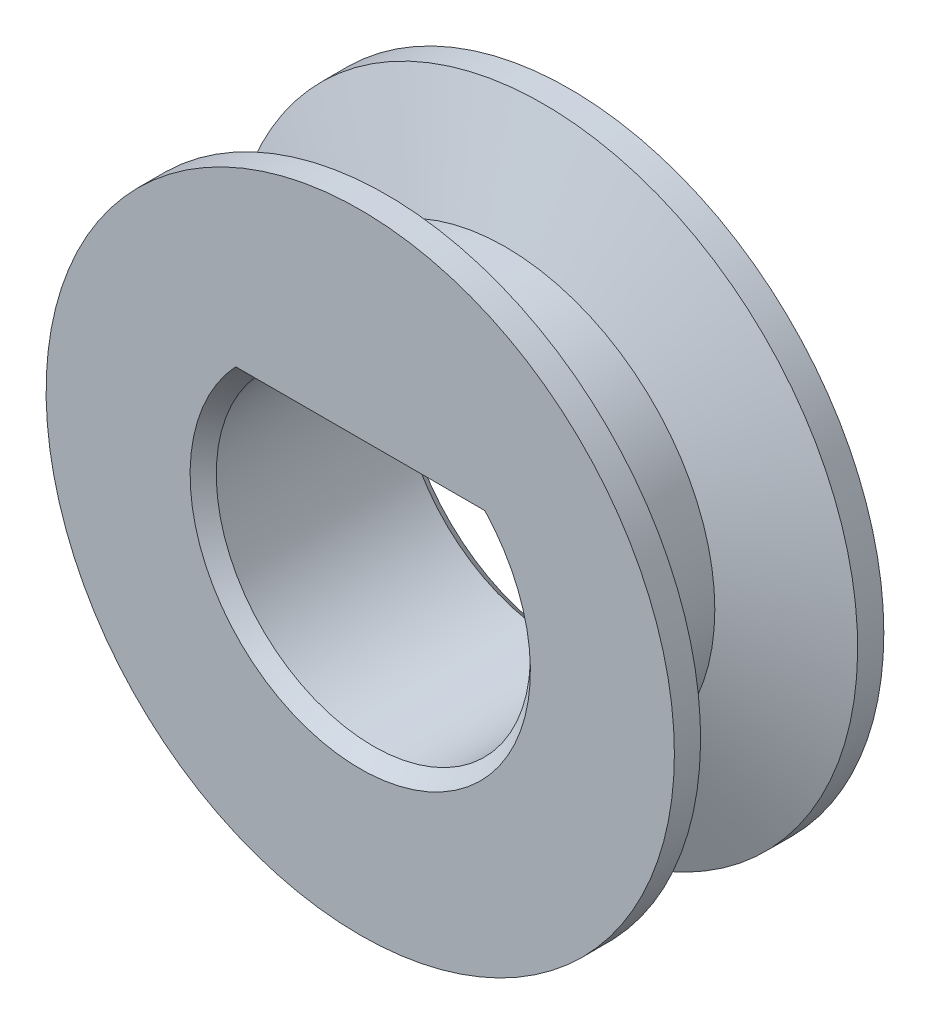
ISO-10303-21;
HEADER;
FILE_DESCRIPTION(('STEP AP214'),'2;1');
FILE_NAME('part.step','',(''),(''),'','','');
FILE_SCHEMA(('AUTOMOTIVE_DESIGN { 1 0 10303 214 1 1 1 1 }'));
ENDSEC;
DATA;
#1=APPLICATION_CONTEXT('core data for automotive mechanical design processes');
#2=APPLICATION_PROTOCOL_DEFINITION('international standard','automotive_design',2000,#1);
#3=PRODUCT_CONTEXT('',#1,'mechanical');
#4=PRODUCT('Part','Part','',(#3));
#5=PRODUCT_RELATED_PRODUCT_CATEGORY('part','',(#4));
#6=PRODUCT_DEFINITION_FORMATION('','',#4);
#7=PRODUCT_DEFINITION_CONTEXT('part definition',#1,'design');
#8=PRODUCT_DEFINITION('design','',#6,#7);
#9=PRODUCT_DEFINITION_SHAPE('','',#8);
#10=(LENGTH_UNIT() NAMED_UNIT(*) SI_UNIT(.MILLI.,.METRE.));
#11=(NAMED_UNIT(*) PLANE_ANGLE_UNIT() SI_UNIT($,.RADIAN.));
#12=(NAMED_UNIT(*) SI_UNIT($,.STERADIAN.) SOLID_ANGLE_UNIT());
#13=UNCERTAINTY_MEASURE_WITH_UNIT(LENGTH_MEASURE(1.E-05),#10,'distance_accuracy_value','');
#14=(GEOMETRIC_REPRESENTATION_CONTEXT(3) GLOBAL_UNCERTAINTY_ASSIGNED_CONTEXT((#13)) GLOBAL_UNIT_ASSIGNED_CONTEXT((#10,
#11,#12)) REPRESENTATION_CONTEXT('',''));
#15=CARTESIAN_POINT('',(0.,0.,0.));
#16=DIRECTION('',(0.,0.,1.));
#17=DIRECTION('',(1.,0.,0.));
#18=AXIS2_PLACEMENT_3D('',#15,#16,#17);
#19=CARTESIAN_POINT('',(0.,0.,6.35));
#20=DIRECTION('',(0.,0.,-1.));
#21=DIRECTION('',(-1.,0.,0.));
#22=AXIS2_PLACEMENT_3D('',#19,#20,#21);
#23=CYLINDRICAL_SURFACE('',#22,19.05);
#24=CARTESIAN_POINT('',(0.,0.,6.35));
#25=DIRECTION('',(0.,0.,1.));
#26=DIRECTION('',(1.,0.,0.));
#27=AXIS2_PLACEMENT_3D('',#24,#25,#26);
#28=CIRCLE('',#27,19.05);
#29=CARTESIAN_POINT('',(19.05,0.,6.35));
#30=VERTEX_POINT('',#29);
#31=EDGE_CURVE('E111',#30,#30,#28,.T.);
#32=ORIENTED_EDGE('',*,*,#31,.F.);
#33=EDGE_LOOP('',(#32));
#34=FACE_BOUND('',#33,.T.);
#35=CARTESIAN_POINT('',(0.,0.,4.76250000000002));
#36=DIRECTION('',(0.,0.,1.));
#37=DIRECTION('',(0.,-1.,0.));
#38=AXIS2_PLACEMENT_3D('',#35,#36,#37);
#39=CIRCLE('',#38,19.05);
#40=CARTESIAN_POINT('',(0.,-19.05,4.76250000000004));
#41=VERTEX_POINT('',#40);
#42=EDGE_CURVE('E116',#41,#41,#39,.T.);
#43=ORIENTED_EDGE('',*,*,#42,.T.);
#44=EDGE_LOOP('',(#43));
#45=FACE_BOUND('',#44,.T.);
#46=ADVANCED_FACE('F39',(#34,#45),#23,.T.);
#47=CARTESIAN_POINT('',(0.,0.,-6.35));
#48=DIRECTION('',(0.,0.,1.));
#49=DIRECTION('',(1.,0.,0.));
#50=AXIS2_PLACEMENT_3D('',#47,#48,#49);
#51=CIRCLE('',#50,19.05);
#52=CARTESIAN_POINT('',(19.05,0.,-6.35));
#53=VERTEX_POINT('',#52);
#54=EDGE_CURVE('E112',#53,#53,#51,.T.);
#55=ORIENTED_EDGE('',*,*,#54,.T.);
#56=EDGE_LOOP('',(#55));
#57=FACE_BOUND('',#56,.T.);
#58=CARTESIAN_POINT('',(0.,0.,-4.76249999999998));
#59=DIRECTION('',(0.,0.,1.));
#60=DIRECTION('',(0.,-1.,0.));
#61=AXIS2_PLACEMENT_3D('',#58,#59,#60);
#62=CIRCLE('',#61,19.05);
#63=CARTESIAN_POINT('',(0.,-19.05,-4.76249999999996));
#64=VERTEX_POINT('',#63);
#65=EDGE_CURVE('E123',#64,#64,#62,.T.);
#66=ORIENTED_EDGE('',*,*,#65,.F.);
#67=EDGE_LOOP('',(#66));
#68=FACE_BOUND('',#67,.T.);
#69=ADVANCED_FACE('F172',(#57,#68),#23,.T.);
#70=CARTESIAN_POINT('',(0.,0.,6.35));
#71=DIRECTION('',(0.,0.,1.));
#72=DIRECTION('',(1.,0.,0.));
#73=AXIS2_PLACEMENT_3D('',#70,#71,#72);
#74=PLANE('',#73);
#75=CARTESIAN_POINT('',(0.,0.,6.35));
#76=DIRECTION('',(0.,0.,1.));
#77=DIRECTION('',(1.,0.,0.));
#78=AXIS2_PLACEMENT_3D('',#75,#76,#77);
#79=CIRCLE('',#78,10.31875);
#80=CARTESIAN_POINT('',(7.55817283227236,7.02499999999999,6.35));
#81=VERTEX_POINT('',#80);
#82=CARTESIAN_POINT('',(-7.55817283227237,7.025,6.35));
#83=VERTEX_POINT('',#82);
#84=EDGE_CURVE('E93',#81,#83,#79,.F.);
#85=ORIENTED_EDGE('',*,*,#84,.T.);
#86=DIRECTION('',(-1.,0.,0.));
#87=VECTOR('',#86,1.);
#88=CARTESIAN_POINT('',(0.,7.025,6.35));
#89=LINE('',#88,#87);
#90=EDGE_CURVE('E60',#81,#83,#89,.T.);
#91=ORIENTED_EDGE('',*,*,#90,.F.);
#92=EDGE_LOOP('',(#85,#91));
#93=FACE_BOUND('',#92,.T.);
#94=ORIENTED_EDGE('',*,*,#31,.T.);
#95=EDGE_LOOP('',(#94));
#96=FACE_BOUND('',#95,.T.);
#97=ADVANCED_FACE('F96',(#93,#96),#74,.T.);
#98=CARTESIAN_POINT('',(0.,0.,-6.35));
#99=DIRECTION('',(0.,0.,1.));
#100=DIRECTION('',(1.,0.,0.));
#101=AXIS2_PLACEMENT_3D('',#98,#99,#100);
#102=PLANE('',#101);
#103=CARTESIAN_POINT('',(0.,0.,-6.35));
#104=DIRECTION('',(0.,0.,1.));
#105=DIRECTION('',(1.,0.,0.));
#106=AXIS2_PLACEMENT_3D('',#103,#104,#105);
#107=CIRCLE('',#106,10.31875);
#108=CARTESIAN_POINT('',(-7.55817283227237,7.025,-6.35));
#109=VERTEX_POINT('',#108);
#110=CARTESIAN_POINT('',(7.55817283227237,7.025,-6.35));
#111=VERTEX_POINT('',#110);
#112=EDGE_CURVE('E107',#109,#111,#107,.T.);
#113=ORIENTED_EDGE('',*,*,#112,.T.);
#114=DIRECTION('',(-1.,0.,0.));
#115=VECTOR('',#114,1.);
#116=CARTESIAN_POINT('',(0.,7.025,-6.35));
#117=LINE('',#116,#115);
#118=EDGE_CURVE('E89',#111,#109,#117,.T.);
#119=ORIENTED_EDGE('',*,*,#118,.T.);
#120=EDGE_LOOP('',(#113,#119));
#121=FACE_BOUND('',#120,.T.);
#122=ORIENTED_EDGE('',*,*,#54,.F.);
#123=EDGE_LOOP('',(#122));
#124=FACE_BOUND('',#123,.T.);
#125=ADVANCED_FACE('F168',(#121,#124),#102,.F.);
#126=CARTESIAN_POINT('',(0.,0.,6.35));
#127=DIRECTION('',(0.,0.,-1.));
#128=DIRECTION('',(-1.,0.,0.));
#129=AXIS2_PLACEMENT_3D('',#126,#127,#128);
#130=CYLINDRICAL_SURFACE('',#129,9.525);
#131=DIRECTION('',(0.,0.,-1.));
#132=VECTOR('',#131,1.);
#133=CARTESIAN_POINT('',(-6.4323401651343,7.025,6.35));
#134=LINE('',#133,#132);
#135=CARTESIAN_POINT('',(-6.4323401651343,7.025,5.55625000000001));
#136=VERTEX_POINT('',#135);
#137=CARTESIAN_POINT('',(-6.4323401651343,7.025,-5.55624999999999));
#138=VERTEX_POINT('',#137);
#139=EDGE_CURVE('E67',#136,#138,#134,.T.);
#140=ORIENTED_EDGE('',*,*,#139,.F.);
#141=CARTESIAN_POINT('',(0.,0.,5.55625000000001));
#142=DIRECTION('',(0.,0.,1.));
#143=DIRECTION('',(1.,0.,0.));
#144=AXIS2_PLACEMENT_3D('',#141,#142,#143);
#145=CIRCLE('',#144,9.525);
#146=CARTESIAN_POINT('',(6.4323401651343,7.025,5.55625000000001));
#147=VERTEX_POINT('',#146);
#148=EDGE_CURVE('E95',#136,#147,#145,.T.);
#149=ORIENTED_EDGE('',*,*,#148,.T.);
#150=DIRECTION('',(0.,0.,-1.));
#151=VECTOR('',#150,1.);
#152=CARTESIAN_POINT('',(6.4323401651343,7.025,6.35));
#153=LINE('',#152,#151);
#154=CARTESIAN_POINT('',(6.4323401651343,7.025,-5.55624999999999));
#155=VERTEX_POINT('',#154);
#156=EDGE_CURVE('E88',#155,#147,#153,.F.);
#157=ORIENTED_EDGE('',*,*,#156,.F.);
#158=CARTESIAN_POINT('',(0.,0.,-5.55624999999999));
#159=DIRECTION('',(0.,0.,1.));
#160=DIRECTION('',(1.,0.,0.));
#161=AXIS2_PLACEMENT_3D('',#158,#159,#160);
#162=CIRCLE('',#161,9.525);
#163=EDGE_CURVE('E99',#155,#138,#162,.F.);
#164=ORIENTED_EDGE('',*,*,#163,.T.);
#165=EDGE_LOOP('',(#140,#149,#157,#164));
#166=FACE_BOUND('',#165,.T.);
#167=ADVANCED_FACE('F165',(#166),#130,.F.);
#168=CARTESIAN_POINT('',(0.,0.,-6.35));
#169=DIRECTION('',(0.,0.,-1.));
#170=DIRECTION('',(-1.,0.,0.));
#171=AXIS2_PLACEMENT_3D('',#168,#169,#170);
#172=CONICAL_SURFACE('',#171,10.31875,0.785398163397444);
#173=CARTESIAN_POINT('',(7.55887283227237,7.025,-6.3505127398698));
#174=CARTESIAN_POINT('',(7.35918376734583,7.025,-6.20428210737378));
#175=CARTESIAN_POINT('',(7.15823650909128,7.025,-6.05973510950676));
#176=CARTESIAN_POINT('',(6.75330813641482,7.025,-5.77480510392177));
#177=CARTESIAN_POINT('',(6.54932596627355,7.025,-5.63442359857722));
#178=CARTESIAN_POINT('',(6.13572671734288,7.025,-5.35723538660261));
#179=CARTESIAN_POINT('',(5.92607255101002,7.025,-5.22048378604721));
#180=CARTESIAN_POINT('',(5.5027547191316,7.025,-4.95335500391701));
#181=CARTESIAN_POINT('',(5.28909143621302,7.025,-4.82297721826932));
#182=CARTESIAN_POINT('',(4.84720322304358,7.025,-4.56427107586428));
#183=CARTESIAN_POINT('',(4.61876043588918,7.025,-4.43631250634793));
#184=CARTESIAN_POINT('',(4.15604697189045,7.025,-4.19120319052274));
#185=CARTESIAN_POINT('',(3.92177517493466,7.025,-4.07405454215037));
#186=CARTESIAN_POINT('',(3.44783902345874,7.025,-3.85393355395984));
#187=CARTESIAN_POINT('',(3.20820254625919,7.025,-3.75090178751882));
#188=CARTESIAN_POINT('',(2.7222966344759,7.025,-3.56195297840616));
#189=CARTESIAN_POINT('',(2.47603006971896,7.025,-3.47602866181999));
#190=CARTESIAN_POINT('',(1.99237061337791,7.025,-3.32990663640797));
#191=CARTESIAN_POINT('',(1.75536251931875,7.025,-3.26845237530359));
#192=CARTESIAN_POINT('',(1.27660854390951,7.025,-3.1674727036118));
#193=CARTESIAN_POINT('',(1.03486225677415,7.025,-3.12794917977335));
#194=CARTESIAN_POINT('',(0.552693200414345,7.025,-3.07395724161468));
#195=CARTESIAN_POINT('',(0.312317663752019,7.025,-3.05907476799949));
#196=CARTESIAN_POINT('',(-0.16868481179032,7.025,-3.0541593905883));
#197=CARTESIAN_POINT('',(-0.409311740248259,7.025,-3.06412549454263));
#198=CARTESIAN_POINT('',(-0.887554271636123,7.025,-3.10810027201538));
#199=CARTESIAN_POINT('',(-1.12517692268705,7.025,-3.14203391318887));
#200=CARTESIAN_POINT('',(-1.59626144111941,7.025,-3.2316060393892));
#201=CARTESIAN_POINT('',(-1.82972256784798,7.025,-3.28724834849942));
#202=CARTESIAN_POINT('',(-2.2951310330695,7.025,-3.41823297936481));
#203=CARTESIAN_POINT('',(-2.52698980625698,7.025,-3.49388525698239));
#204=CARTESIAN_POINT('',(-2.98482535058206,7.025,-3.66108327264713));
#205=CARTESIAN_POINT('',(-3.21080225130836,7.025,-3.75262866019784));
#206=CARTESIAN_POINT('',(-3.62223490032216,7.025,-3.93331260256056));
#207=CARTESIAN_POINT('',(-3.80851369015216,7.025,-4.02059974805056));
#208=CARTESIAN_POINT('',(-4.17730547652867,7.025,-4.20283487097956));
#209=CARTESIAN_POINT('',(-4.35981788631635,7.025,-4.29778403092634));
#210=CARTESIAN_POINT('',(-4.72157623630674,7.025,-4.49415765684354));
#211=CARTESIAN_POINT('',(-4.90081822965931,7.025,-4.59558935726588));
#212=CARTESIAN_POINT('',(-5.25618202441422,7.025,-4.80378331806423));
#213=CARTESIAN_POINT('',(-5.43230364666882,7.025,-4.91054588316256));
#214=CARTESIAN_POINT('',(-5.77438365628095,7.025,-5.12394084059767));
#215=CARTESIAN_POINT('',(-5.94045743064147,7.025,-5.23038886935132));
#216=CARTESIAN_POINT('',(-6.27032150157057,7.025,-5.44677261375207));
#217=CARTESIAN_POINT('',(-6.43411171217845,7.025,-5.55670846018436));
#218=CARTESIAN_POINT('',(-6.75910887197629,7.025,-5.77918172824512));
#219=CARTESIAN_POINT('',(-6.92032261604102,7.025,-5.89170924773563));
#220=CARTESIAN_POINT('',(-7.24091463316011,7.025,-6.11930298739435));
#221=CARTESIAN_POINT('',(-7.40029316678262,7.025,-6.23436884022645));
#222=CARTESIAN_POINT('',(-7.55887283227237,7.025,-6.3505127398698));
#223=B_SPLINE_CURVE_WITH_KNOTS('',3,(#173,#174,#175,#176,#177,#178,#179,#180,#181,#182,#183,
#184,#185,#186,#187,#188,#189,#190,#191,#192,#193,#194,#195,#196,#197,#198,#199,#200,#201,#202,
#203,#204,#205,#206,#207,#208,#209,#210,#211,#212,#213,#214,#215,#216,#217,#218,#219,#220,#221,
#222),.UNSPECIFIED.,.F.,.F.,(4,2,2,2,2,2,2,2,2,2,2,2,2,2,2,2,2,2,2,2,2,2,2,2,4),(0.,
0.742538822186625,1.48534227943686,2.2361819661253,2.98695035411688,3.77223452403001,
4.55767077890547,5.33969179334179,6.12137958691087,6.85502693102897,7.5887373826389,
8.30998884371148,9.03121150434059,9.75018626868393,10.46928774102,11.2002565723871,
11.9312092854837,12.5481605799352,13.1652072735981,13.7829550344109,14.4007381473705,
14.992469614563,15.5842232966196,16.1740029205942,16.7636977470925),.UNSPECIFIED.);
#224=EDGE_CURVE('E138',#111,#155,#223,.T.);
#225=ORIENTED_EDGE('',*,*,#224,.F.);
#226=ORIENTED_EDGE('',*,*,#112,.F.);
#227=EDGE_CURVE('E135',#138,#109,#223,.T.);
#228=ORIENTED_EDGE('',*,*,#227,.F.);
#229=ORIENTED_EDGE('',*,*,#163,.F.);
#230=EDGE_LOOP('',(#225,#226,#228,#229));
#231=FACE_BOUND('',#230,.T.);
#232=ADVANCED_FACE('F146',(#231),#172,.F.);
#233=CARTESIAN_POINT('',(0.,0.,5.55625000000001));
#234=DIRECTION('',(0.,0.,1.));
#235=DIRECTION('',(1.,0.,0.));
#236=AXIS2_PLACEMENT_3D('',#233,#234,#235);
#237=CONICAL_SURFACE('',#236,9.525,0.78539816339745);
#238=CARTESIAN_POINT('',(-7.55887283227237,7.025,6.35051273986981));
#239=CARTESIAN_POINT('',(-7.35918376734583,7.025,6.20428210737379));
#240=CARTESIAN_POINT('',(-7.15823650909128,7.025,6.05973510950677));
#241=CARTESIAN_POINT('',(-6.75330813641481,7.025,5.77480510392179));
#242=CARTESIAN_POINT('',(-6.54932596627355,7.025,5.63442359857723));
#243=CARTESIAN_POINT('',(-6.13572671734288,7.025,5.35723538660263));
#244=CARTESIAN_POINT('',(-5.92607255101001,7.025,5.22048378604723));
#245=CARTESIAN_POINT('',(-5.50275471913159,7.025,4.95335500391703));
#246=CARTESIAN_POINT('',(-5.28909143621301,7.025,4.82297721826934));
#247=CARTESIAN_POINT('',(-4.84720322304357,7.025,4.56427107586431));
#248=CARTESIAN_POINT('',(-4.61876043588917,7.025,4.43631250634796));
#249=CARTESIAN_POINT('',(-4.15604697189044,7.025,4.19120319052278));
#250=CARTESIAN_POINT('',(-3.92177517493466,7.025,4.0740545421504));
#251=CARTESIAN_POINT('',(-3.44783902345874,7.025,3.85393355395988));
#252=CARTESIAN_POINT('',(-3.20820254625919,7.025,3.75090178751886));
#253=CARTESIAN_POINT('',(-2.72229663447589,7.025,3.5619529784062));
#254=CARTESIAN_POINT('',(-2.47603006971896,7.025,3.47602866182004));
#255=CARTESIAN_POINT('',(-1.9923706133779,7.025,3.32990663640802));
#256=CARTESIAN_POINT('',(-1.75536251931874,7.025,3.26845237530364));
#257=CARTESIAN_POINT('',(-1.2766085439095,7.025,3.16747270361185));
#258=CARTESIAN_POINT('',(-1.03486225677414,7.025,3.1279491797734));
#259=CARTESIAN_POINT('',(-0.552693200414324,7.025,3.07395724161473));
#260=CARTESIAN_POINT('',(-0.312317663751994,7.025,3.05907476799954));
#261=CARTESIAN_POINT('',(0.168684811790351,7.025,3.05415939058835));
#262=CARTESIAN_POINT('',(0.409311740248293,7.025,3.06412549454269));
#263=CARTESIAN_POINT('',(0.887554271636163,7.025,3.10810027201544));
#264=CARTESIAN_POINT('',(1.12517692268709,7.025,3.14203391318893));
#265=CARTESIAN_POINT('',(1.59626144111946,7.025,3.23160603938926));
#266=CARTESIAN_POINT('',(1.82972256784803,7.025,3.28724834849949));
#267=CARTESIAN_POINT('',(2.29513103306955,7.025,3.41823297936488));
#268=CARTESIAN_POINT('',(2.52698980625704,7.025,3.49388525698245));
#269=CARTESIAN_POINT('',(2.98482535058213,7.025,3.6610832726472));
#270=CARTESIAN_POINT('',(3.21080225130843,7.025,3.75262866019792));
#271=CARTESIAN_POINT('',(3.62223490032223,7.025,3.93331260256063));
#272=CARTESIAN_POINT('',(3.80851369015222,7.025,4.02059974805063));
#273=CARTESIAN_POINT('',(4.17730547652872,7.025,4.20283487097963));
#274=CARTESIAN_POINT('',(4.3598178863164,7.025,4.29778403092641));
#275=CARTESIAN_POINT('',(4.72157623630678,7.025,4.4941576568436));
#276=CARTESIAN_POINT('',(4.90081822965935,7.025,4.59558935726594));
#277=CARTESIAN_POINT('',(5.25618202441425,7.025,4.80378331806428));
#278=CARTESIAN_POINT('',(5.43230364666885,7.025,4.91054588316261));
#279=CARTESIAN_POINT('',(5.77438365628098,7.025,5.12394084059772));
#280=CARTESIAN_POINT('',(5.94045743064149,7.025,5.23038886935136));
#281=CARTESIAN_POINT('',(6.27032150157059,7.025,5.4467726137521));
#282=CARTESIAN_POINT('',(6.43411171217847,7.025,5.55670846018439));
#283=CARTESIAN_POINT('',(6.7591088719763,7.025,5.77918172824515));
#284=CARTESIAN_POINT('',(6.92032261604103,7.025,5.89170924773565));
#285=CARTESIAN_POINT('',(7.24091463316012,7.025,6.11930298739436));
#286=CARTESIAN_POINT('',(7.40029316678262,7.025,6.23436884022647));
#287=CARTESIAN_POINT('',(7.55887283227237,7.025,6.35051273986981));
#288=B_SPLINE_CURVE_WITH_KNOTS('',3,(#238,#239,#240,#241,#242,#243,#244,#245,#246,#247,#248,
#249,#250,#251,#252,#253,#254,#255,#256,#257,#258,#259,#260,#261,#262,#263,#264,#265,#266,#267,
#268,#269,#270,#271,#272,#273,#274,#275,#276,#277,#278,#279,#280,#281,#282,#283,#284,#285,#286,
#287),.UNSPECIFIED.,.F.,.F.,(4,2,2,2,2,2,2,2,2,2,2,2,2,2,2,2,2,2,2,2,2,2,2,2,4),(0.,
0.742538822186624,1.48534227943686,2.2361819661253,2.98695035411688,3.77223452403001,
4.55767077890546,5.33969179334177,6.12137958691085,6.85502693102896,7.5887373826389,
8.30998884371149,9.03121150434061,9.75018626868395,10.4692877410201,11.2002565723872,
11.9312092854837,12.5481605799352,13.1652072735981,13.7829550344109,14.4007381473705,
14.992469614563,15.5842232966196,16.1740029205941,16.7636977470924),.UNSPECIFIED.);
#289=EDGE_CURVE('E11',#83,#136,#288,.T.);
#290=ORIENTED_EDGE('',*,*,#289,.F.);
#291=ORIENTED_EDGE('',*,*,#84,.F.);
#292=EDGE_CURVE('E44',#147,#81,#288,.T.);
#293=ORIENTED_EDGE('',*,*,#292,.F.);
#294=ORIENTED_EDGE('',*,*,#148,.F.);
#295=EDGE_LOOP('',(#290,#291,#293,#294));
#296=FACE_BOUND('',#295,.T.);
#297=ADVANCED_FACE('F41',(#296),#237,.F.);
#298=CARTESIAN_POINT('',(0.,0.,4.76250000000002));
#299=DIRECTION('',(0.,0.,1.));
#300=DIRECTION('',(0.,-1.,0.));
#301=AXIS2_PLACEMENT_3D('',#298,#299,#300);
#302=CONICAL_SURFACE('',#301,19.05,1.22173047639603);
#303=CARTESIAN_POINT('',(0.,0.,2.45128901240965));
#304=DIRECTION('',(0.,0.,1.));
#305=DIRECTION('',(0.,-1.,0.));
#306=AXIS2_PLACEMENT_3D('',#303,#304,#305);
#307=CIRCLE('',#306,12.7);
#308=CARTESIAN_POINT('',(0.,-12.7,2.45128901240966));
#309=VERTEX_POINT('',#308);
#310=EDGE_CURVE('E131',#309,#309,#307,.T.);
#311=ORIENTED_EDGE('',*,*,#310,.T.);
#312=EDGE_LOOP('',(#311));
#313=FACE_BOUND('',#312,.T.);
#314=ORIENTED_EDGE('',*,*,#42,.F.);
#315=EDGE_LOOP('',(#314));
#316=FACE_BOUND('',#315,.T.);
#317=ADVANCED_FACE('F160',(#313,#316),#302,.T.);
#318=CARTESIAN_POINT('',(0.,0.,-2.45128901240962));
#319=DIRECTION('',(0.,0.,-1.));
#320=DIRECTION('',(0.,1.,0.));
#321=AXIS2_PLACEMENT_3D('',#318,#319,#320);
#322=CONICAL_SURFACE('',#321,12.7,1.22173047639603);
#323=ORIENTED_EDGE('',*,*,#65,.T.);
#324=EDGE_LOOP('',(#323));
#325=FACE_BOUND('',#324,.T.);
#326=CARTESIAN_POINT('',(0.,0.,-2.45128901240962));
#327=DIRECTION('',(0.,0.,1.));
#328=DIRECTION('',(0.,-1.,0.));
#329=AXIS2_PLACEMENT_3D('',#326,#327,#328);
#330=CIRCLE('',#329,12.7);
#331=CARTESIAN_POINT('',(0.,-12.7,-2.45128901240961));
#332=VERTEX_POINT('',#331);
#333=EDGE_CURVE('E127',#332,#332,#330,.T.);
#334=ORIENTED_EDGE('',*,*,#333,.F.);
#335=EDGE_LOOP('',(#334));
#336=FACE_BOUND('',#335,.T.);
#337=ADVANCED_FACE('F156',(#325,#336),#322,.T.);
#338=CARTESIAN_POINT('',(0.,0.,6.35));
#339=DIRECTION('',(0.,0.,1.));
#340=DIRECTION('',(0.,-1.,0.));
#341=AXIS2_PLACEMENT_3D('',#338,#339,#340);
#342=CYLINDRICAL_SURFACE('',#341,12.7);
#343=ORIENTED_EDGE('',*,*,#333,.T.);
#344=EDGE_LOOP('',(#343));
#345=FACE_BOUND('',#344,.T.);
#346=ORIENTED_EDGE('',*,*,#310,.F.);
#347=EDGE_LOOP('',(#346));
#348=FACE_BOUND('',#347,.T.);
#349=ADVANCED_FACE('F152',(#345,#348),#342,.T.);
#350=CARTESIAN_POINT('',(0.,7.025,6.35));
#351=DIRECTION('',(0.,-1.,0.));
#352=DIRECTION('',(0.,0.,-1.));
#353=AXIS2_PLACEMENT_3D('',#350,#351,#352);
#354=PLANE('',#353);
#355=ORIENTED_EDGE('',*,*,#139,.T.);
#356=ORIENTED_EDGE('',*,*,#227,.T.);
#357=ORIENTED_EDGE('',*,*,#118,.F.);
#358=ORIENTED_EDGE('',*,*,#224,.T.);
#359=ORIENTED_EDGE('',*,*,#156,.T.);
#360=ORIENTED_EDGE('',*,*,#292,.T.);
#361=ORIENTED_EDGE('',*,*,#90,.T.);
#362=ORIENTED_EDGE('',*,*,#289,.T.);
#363=EDGE_LOOP('',(#355,#356,#357,#358,#359,#360,#361,#362));
#364=FACE_BOUND('',#363,.T.);
#365=ADVANCED_FACE('F84',(#364),#354,.T.);
#366=CLOSED_SHELL('',(#46,#69,#97,#125,#167,#232,#297,#317,#337,#349,#365));
#367=MANIFOLD_SOLID_BREP('B2',#366);
#368=ADVANCED_BREP_SHAPE_REPRESENTATION('',(#18,#367),#14);
#369=SHAPE_DEFINITION_REPRESENTATION(#9,#368);
ENDSEC;
END-ISO-10303-21;
